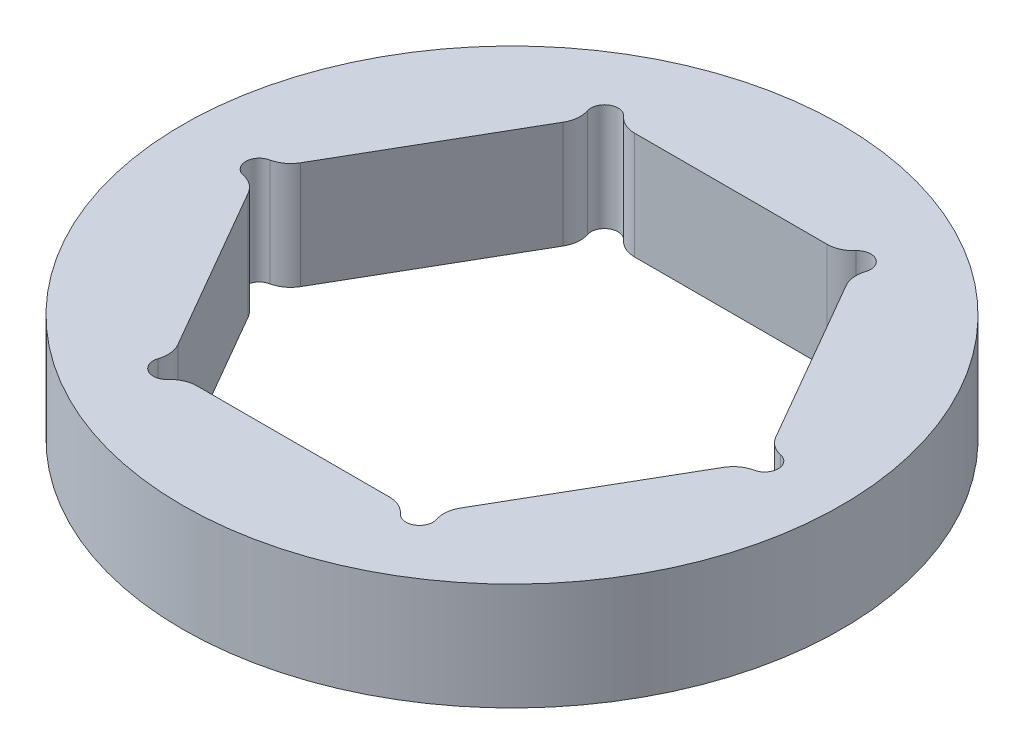
ISO-10303-21;
HEADER;
FILE_DESCRIPTION(('STEP AP214'),'2;1');
FILE_NAME('part.step','',(''),(''),'','','');
FILE_SCHEMA(('AUTOMOTIVE_DESIGN { 1 0 10303 214 1 1 1 1 }'));
ENDSEC;
DATA;
#1=APPLICATION_CONTEXT('core data for automotive mechanical design processes');
#2=APPLICATION_PROTOCOL_DEFINITION('international standard','automotive_design',2000,#1);
#3=PRODUCT_CONTEXT('',#1,'mechanical');
#4=PRODUCT('Part','Part','',(#3));
#5=PRODUCT_RELATED_PRODUCT_CATEGORY('part','',(#4));
#6=PRODUCT_DEFINITION_FORMATION('','',#4);
#7=PRODUCT_DEFINITION_CONTEXT('part definition',#1,'design');
#8=PRODUCT_DEFINITION('design','',#6,#7);
#9=PRODUCT_DEFINITION_SHAPE('','',#8);
#10=(LENGTH_UNIT() NAMED_UNIT(*) SI_UNIT(.MILLI.,.METRE.));
#11=(NAMED_UNIT(*) PLANE_ANGLE_UNIT() SI_UNIT($,.RADIAN.));
#12=(NAMED_UNIT(*) SI_UNIT($,.STERADIAN.) SOLID_ANGLE_UNIT());
#13=UNCERTAINTY_MEASURE_WITH_UNIT(LENGTH_MEASURE(1.E-05),#10,'distance_accuracy_value','');
#14=(GEOMETRIC_REPRESENTATION_CONTEXT(3) GLOBAL_UNCERTAINTY_ASSIGNED_CONTEXT((#13)) GLOBAL_UNIT_ASSIGNED_CONTEXT((#10,
#11,#12)) REPRESENTATION_CONTEXT('',''));
#15=CARTESIAN_POINT('',(0.,0.,0.));
#16=DIRECTION('',(0.,0.,1.));
#17=DIRECTION('',(1.,0.,0.));
#18=AXIS2_PLACEMENT_3D('',#15,#16,#17);
#19=CARTESIAN_POINT('',(0.,1.5875,0.));
#20=DIRECTION('',(0.,1.,0.));
#21=DIRECTION('',(0.,0.,1.));
#22=AXIS2_PLACEMENT_3D('',#19,#20,#21);
#23=PLANE('',#22);
#24=CARTESIAN_POINT('',(0.,1.5875,0.));
#25=DIRECTION('',(0.,1.,0.));
#26=DIRECTION('',(0.,0.,1.));
#27=AXIS2_PLACEMENT_3D('',#24,#25,#26);
#28=CIRCLE('',#27,9.7536);
#29=CARTESIAN_POINT('',(0.,1.5875,9.7536));
#30=VERTEX_POINT('',#29);
#31=EDGE_CURVE('E11',#30,#30,#28,.T.);
#32=ORIENTED_EDGE('',*,*,#31,.T.);
#33=EDGE_LOOP('',(#32));
#34=FACE_BOUND('',#33,.T.);
#35=CARTESIAN_POINT('',(-3.7394976935412,1.5875,-6.477));
#36=DIRECTION('',(0.,1.,0.));
#37=DIRECTION('',(0.,0.,1.));
#38=AXIS2_PLACEMENT_3D('',#35,#36,#37);
#39=CIRCLE('',#38,0.4);
#40=CARTESIAN_POINT('',(-3.44135529654123,1.5875,-6.74366666666667));
#41=VERTEX_POINT('',#40);
#42=CARTESIAN_POINT('',(-4.11950899971704,1.5875,-6.35213444358617));
#43=VERTEX_POINT('',#42);
#44=EDGE_CURVE('E210',#41,#43,#39,.T.);
#45=ORIENTED_EDGE('',*,*,#44,.F.);
#46=CARTESIAN_POINT('',(-2.84507050254129,1.5875,-7.277));
#47=DIRECTION('',(0.,-1.,0.));
#48=DIRECTION('',(0.,0.,1.));
#49=AXIS2_PLACEMENT_3D('',#46,#47,#48);
#50=CIRCLE('',#49,0.8);
#51=CARTESIAN_POINT('',(-2.84507050254129,1.5875,-6.477));
#52=VERTEX_POINT('',#51);
#53=EDGE_CURVE('E202',#52,#41,#50,.T.);
#54=ORIENTED_EDGE('',*,*,#53,.F.);
#55=DIRECTION('',(-1.,0.,0.));
#56=VECTOR('',#55,1.);
#57=CARTESIAN_POINT('',(2.84507050254129,1.5875,-6.477));
#58=LINE('',#57,#56);
#59=CARTESIAN_POINT('',(2.84507050254129,1.5875,-6.477));
#60=VERTEX_POINT('',#59);
#61=EDGE_CURVE('E266',#60,#52,#58,.T.);
#62=ORIENTED_EDGE('',*,*,#61,.F.);
#63=CARTESIAN_POINT('',(2.84507050254129,1.5875,-7.277));
#64=DIRECTION('',(0.,-1.,0.));
#65=DIRECTION('',(0.,0.,1.));
#66=AXIS2_PLACEMENT_3D('',#63,#64,#65);
#67=CIRCLE('',#66,0.800000000000002);
#68=CARTESIAN_POINT('',(3.44135529654124,1.5875,-6.74366666666666));
#69=VERTEX_POINT('',#68);
#70=EDGE_CURVE('E264',#69,#60,#67,.T.);
#71=ORIENTED_EDGE('',*,*,#70,.F.);
#72=CARTESIAN_POINT('',(3.73949769354121,1.5875,-6.477));
#73=DIRECTION('',(0.,1.,0.));
#74=DIRECTION('',(0.,0.,1.));
#75=AXIS2_PLACEMENT_3D('',#72,#73,#74);
#76=CIRCLE('',#75,0.4);
#77=CARTESIAN_POINT('',(4.11950899971704,1.5875,-6.35213444358617));
#78=VERTEX_POINT('',#77);
#79=EDGE_CURVE('E262',#78,#69,#76,.T.);
#80=ORIENTED_EDGE('',*,*,#79,.F.);
#81=CARTESIAN_POINT('',(4.87953161206872,1.5875,-6.10240333075852));
#82=DIRECTION('',(0.,-1.,0.));
#83=DIRECTION('',(0.,0.,1.));
#84=AXIS2_PLACEMENT_3D('',#81,#82,#83);
#85=CIRCLE('',#84,0.799999999999999);
#86=CARTESIAN_POINT('',(4.18671128904117,1.5875,-5.70240333075852));
#87=VERTEX_POINT('',#86);
#88=EDGE_CURVE('E260',#87,#78,#85,.T.);
#89=ORIENTED_EDGE('',*,*,#88,.F.);
#90=DIRECTION('',(-0.5,0.,-0.866025403784439));
#91=VECTOR('',#90,1.);
#92=CARTESIAN_POINT('',(7.03178179158246,1.5875,-0.77459666924148));
#93=LINE('',#92,#91);
#94=CARTESIAN_POINT('',(7.03178179158246,1.5875,-0.77459666924148));
#95=VERTEX_POINT('',#94);
#96=EDGE_CURVE('E258',#95,#87,#93,.T.);
#97=ORIENTED_EDGE('',*,*,#96,.F.);
#98=CARTESIAN_POINT('',(7.72460211461001,1.5875,-1.17459666924148));
#99=DIRECTION('',(0.,-1.,0.));
#100=DIRECTION('',(0.,0.,1.));
#101=AXIS2_PLACEMENT_3D('',#98,#99,#100);
#102=CIRCLE('',#101,0.800000000000001);
#103=CARTESIAN_POINT('',(7.56086429625828,1.5875,-0.391532223080492));
#104=VERTEX_POINT('',#103);
#105=EDGE_CURVE('E256',#104,#95,#102,.T.);
#106=ORIENTED_EDGE('',*,*,#105,.F.);
#107=CARTESIAN_POINT('',(7.47899538708241,1.5875,0.));
#108=DIRECTION('',(0.,1.,0.));
#109=DIRECTION('',(0.,0.,1.));
#110=AXIS2_PLACEMENT_3D('',#107,#108,#109);
#111=CIRCLE('',#110,0.4);
#112=CARTESIAN_POINT('',(7.56086429625828,1.5875,0.391532223080496));
#113=VERTEX_POINT('',#112);
#114=EDGE_CURVE('E254',#113,#104,#111,.T.);
#115=ORIENTED_EDGE('',*,*,#114,.F.);
#116=CARTESIAN_POINT('',(7.72460211461001,1.5875,1.17459666924148));
#117=DIRECTION('',(0.,-1.,0.));
#118=DIRECTION('',(0.,0.,1.));
#119=AXIS2_PLACEMENT_3D('',#116,#117,#118);
#120=CIRCLE('',#119,0.8);
#121=CARTESIAN_POINT('',(7.03178179158246,1.5875,0.774596669241483));
#122=VERTEX_POINT('',#121);
#123=EDGE_CURVE('E252',#122,#113,#120,.T.);
#124=ORIENTED_EDGE('',*,*,#123,.F.);
#125=DIRECTION('',(0.5,0.,-0.866025403784438));
#126=VECTOR('',#125,1.);
#127=CARTESIAN_POINT('',(4.18671128904117,1.5875,5.70240333075852));
#128=LINE('',#127,#126);
#129=CARTESIAN_POINT('',(4.18671128904117,1.5875,5.70240333075852));
#130=VERTEX_POINT('',#129);
#131=EDGE_CURVE('E250',#130,#122,#128,.T.);
#132=ORIENTED_EDGE('',*,*,#131,.F.);
#133=CARTESIAN_POINT('',(4.87953161206872,1.5875,6.10240333075852));
#134=DIRECTION('',(0.,-1.,0.));
#135=DIRECTION('',(0.,0.,1.));
#136=AXIS2_PLACEMENT_3D('',#133,#134,#135);
#137=CIRCLE('',#136,0.800000000000001);
#138=CARTESIAN_POINT('',(4.11950899971704,1.5875,6.35213444358617));
#139=VERTEX_POINT('',#138);
#140=EDGE_CURVE('E248',#139,#130,#137,.T.);
#141=ORIENTED_EDGE('',*,*,#140,.F.);
#142=CARTESIAN_POINT('',(3.73949769354121,1.5875,6.477));
#143=DIRECTION('',(0.,1.,0.));
#144=DIRECTION('',(0.,0.,1.));
#145=AXIS2_PLACEMENT_3D('',#142,#143,#144);
#146=CIRCLE('',#145,0.4);
#147=CARTESIAN_POINT('',(3.44135529654124,1.5875,6.74366666666667));
#148=VERTEX_POINT('',#147);
#149=EDGE_CURVE('E246',#148,#139,#146,.T.);
#150=ORIENTED_EDGE('',*,*,#149,.F.);
#151=CARTESIAN_POINT('',(2.8450705025413,1.5875,7.277));
#152=DIRECTION('',(0.,-1.,0.));
#153=DIRECTION('',(0.,0.,1.));
#154=AXIS2_PLACEMENT_3D('',#151,#152,#153);
#155=CIRCLE('',#154,0.799999999999996);
#156=CARTESIAN_POINT('',(2.8450705025413,1.5875,6.477));
#157=VERTEX_POINT('',#156);
#158=EDGE_CURVE('E244',#157,#148,#155,.T.);
#159=ORIENTED_EDGE('',*,*,#158,.F.);
#160=DIRECTION('',(1.,0.,0.));
#161=VECTOR('',#160,1.);
#162=CARTESIAN_POINT('',(-2.84507050254129,1.5875,6.477));
#163=LINE('',#162,#161);
#164=CARTESIAN_POINT('',(-2.84507050254129,1.5875,6.477));
#165=VERTEX_POINT('',#164);
#166=EDGE_CURVE('E242',#165,#157,#163,.T.);
#167=ORIENTED_EDGE('',*,*,#166,.F.);
#168=CARTESIAN_POINT('',(-2.84507050254129,1.5875,7.277));
#169=DIRECTION('',(0.,-1.,0.));
#170=DIRECTION('',(0.,0.,1.));
#171=AXIS2_PLACEMENT_3D('',#168,#169,#170);
#172=CIRCLE('',#171,0.799999999999998);
#173=CARTESIAN_POINT('',(-3.44135529654123,1.5875,6.74366666666667));
#174=VERTEX_POINT('',#173);
#175=EDGE_CURVE('E240',#174,#165,#172,.T.);
#176=ORIENTED_EDGE('',*,*,#175,.F.);
#177=CARTESIAN_POINT('',(-3.7394976935412,1.5875,6.477));
#178=DIRECTION('',(0.,1.,0.));
#179=DIRECTION('',(0.,0.,1.));
#180=AXIS2_PLACEMENT_3D('',#177,#178,#179);
#181=CIRCLE('',#180,0.4);
#182=CARTESIAN_POINT('',(-4.11950899971704,1.5875,6.35213444358618));
#183=VERTEX_POINT('',#182);
#184=EDGE_CURVE('E238',#183,#174,#181,.T.);
#185=ORIENTED_EDGE('',*,*,#184,.F.);
#186=CARTESIAN_POINT('',(-4.87953161206871,1.5875,6.10240333075852));
#187=DIRECTION('',(0.,-1.,0.));
#188=DIRECTION('',(0.,0.,1.));
#189=AXIS2_PLACEMENT_3D('',#186,#187,#188);
#190=CIRCLE('',#189,0.8);
#191=CARTESIAN_POINT('',(-4.18671128904116,1.5875,5.70240333075852));
#192=VERTEX_POINT('',#191);
#193=EDGE_CURVE('E236',#192,#183,#190,.T.);
#194=ORIENTED_EDGE('',*,*,#193,.F.);
#195=DIRECTION('',(0.5,0.,0.866025403784438));
#196=VECTOR('',#195,1.);
#197=CARTESIAN_POINT('',(-7.03178179158245,1.5875,0.774596669241489));
#198=LINE('',#197,#196);
#199=CARTESIAN_POINT('',(-7.03178179158245,1.5875,0.774596669241489));
#200=VERTEX_POINT('',#199);
#201=EDGE_CURVE('E234',#200,#192,#198,.T.);
#202=ORIENTED_EDGE('',*,*,#201,.F.);
#203=CARTESIAN_POINT('',(-7.72460211461,1.5875,1.17459666924149));
#204=DIRECTION('',(0.,-1.,0.));
#205=DIRECTION('',(0.,0.,1.));
#206=AXIS2_PLACEMENT_3D('',#203,#204,#205);
#207=CIRCLE('',#206,0.8);
#208=CARTESIAN_POINT('',(-7.56086429625827,1.5875,0.3915322230805));
#209=VERTEX_POINT('',#208);
#210=EDGE_CURVE('E232',#209,#200,#207,.T.);
#211=ORIENTED_EDGE('',*,*,#210,.F.);
#212=CARTESIAN_POINT('',(-7.47899538708241,1.5875,0.));
#213=DIRECTION('',(0.,1.,0.));
#214=DIRECTION('',(0.,0.,1.));
#215=AXIS2_PLACEMENT_3D('',#212,#213,#214);
#216=CIRCLE('',#215,0.4);
#217=CARTESIAN_POINT('',(-7.56086429625827,1.5875,-0.391532223080488));
#218=VERTEX_POINT('',#217);
#219=EDGE_CURVE('E230',#218,#209,#216,.T.);
#220=ORIENTED_EDGE('',*,*,#219,.F.);
#221=CARTESIAN_POINT('',(-7.72460211461001,1.5875,-1.17459666924148));
#222=DIRECTION('',(0.,-1.,0.));
#223=DIRECTION('',(0.,0.,1.));
#224=AXIS2_PLACEMENT_3D('',#221,#222,#223);
#225=CIRCLE('',#224,0.8);
#226=CARTESIAN_POINT('',(-7.03178179158246,1.5875,-0.774596669241475));
#227=VERTEX_POINT('',#226);
#228=EDGE_CURVE('E228',#227,#218,#225,.T.);
#229=ORIENTED_EDGE('',*,*,#228,.F.);
#230=DIRECTION('',(-0.5,0.,0.866025403784438));
#231=VECTOR('',#230,1.);
#232=CARTESIAN_POINT('',(-4.18671128904116,1.5875,-5.70240333075852));
#233=LINE('',#232,#231);
#234=CARTESIAN_POINT('',(-4.18671128904116,1.5875,-5.70240333075852));
#235=VERTEX_POINT('',#234);
#236=EDGE_CURVE('E224',#235,#227,#233,.T.);
#237=ORIENTED_EDGE('',*,*,#236,.F.);
#238=CARTESIAN_POINT('',(-4.87953161206871,1.5875,-6.10240333075852));
#239=DIRECTION('',(0.,-1.,0.));
#240=DIRECTION('',(0.,0.,1.));
#241=AXIS2_PLACEMENT_3D('',#238,#239,#240);
#242=CIRCLE('',#241,0.8);
#243=EDGE_CURVE('E222',#43,#235,#242,.T.);
#244=ORIENTED_EDGE('',*,*,#243,.F.);
#245=EDGE_LOOP('',(#45,#54,#62,#71,#80,#89,#97,#106,#115,#124,#132,#141,#150,#159,#167,#176,
#185,#194,#202,#211,#220,#229,#237,#244));
#246=FACE_BOUND('',#245,.T.);
#247=ADVANCED_FACE('F41',(#34,#246),#23,.T.);
#248=CARTESIAN_POINT('',(0.,-1.5875,0.));
#249=DIRECTION('',(0.,1.,0.));
#250=DIRECTION('',(0.,0.,1.));
#251=AXIS2_PLACEMENT_3D('',#248,#249,#250);
#252=PLANE('',#251);
#253=CARTESIAN_POINT('',(0.,-1.5875,0.));
#254=DIRECTION('',(0.,1.,0.));
#255=DIRECTION('',(0.,0.,1.));
#256=AXIS2_PLACEMENT_3D('',#253,#254,#255);
#257=CIRCLE('',#256,9.7536);
#258=CARTESIAN_POINT('',(0.,-1.5875,9.7536));
#259=VERTEX_POINT('',#258);
#260=EDGE_CURVE('E45',#259,#259,#257,.T.);
#261=ORIENTED_EDGE('',*,*,#260,.F.);
#262=EDGE_LOOP('',(#261));
#263=FACE_BOUND('',#262,.T.);
#264=CARTESIAN_POINT('',(-2.84507050254129,-1.5875,-7.277));
#265=DIRECTION('',(0.,-1.,0.));
#266=DIRECTION('',(0.,0.,1.));
#267=AXIS2_PLACEMENT_3D('',#264,#265,#266);
#268=CIRCLE('',#267,0.8);
#269=CARTESIAN_POINT('',(-2.84507050254129,-1.5875,-6.477));
#270=VERTEX_POINT('',#269);
#271=CARTESIAN_POINT('',(-3.44135529654123,-1.5875,-6.74366666666667));
#272=VERTEX_POINT('',#271);
#273=EDGE_CURVE('E64',#270,#272,#268,.T.);
#274=ORIENTED_EDGE('',*,*,#273,.T.);
#275=CARTESIAN_POINT('',(-3.7394976935412,-1.5875,-6.477));
#276=DIRECTION('',(0.,1.,0.));
#277=DIRECTION('',(0.,0.,1.));
#278=AXIS2_PLACEMENT_3D('',#275,#276,#277);
#279=CIRCLE('',#278,0.4);
#280=CARTESIAN_POINT('',(-4.11950899971704,-1.5875,-6.35213444358617));
#281=VERTEX_POINT('',#280);
#282=EDGE_CURVE('E217',#272,#281,#279,.T.);
#283=ORIENTED_EDGE('',*,*,#282,.T.);
#284=CARTESIAN_POINT('',(-4.87953161206871,-1.5875,-6.10240333075852));
#285=DIRECTION('',(0.,-1.,0.));
#286=DIRECTION('',(0.,0.,1.));
#287=AXIS2_PLACEMENT_3D('',#284,#285,#286);
#288=CIRCLE('',#287,0.8);
#289=CARTESIAN_POINT('',(-4.18671128904116,-1.5875,-5.70240333075852));
#290=VERTEX_POINT('',#289);
#291=EDGE_CURVE('E270',#281,#290,#288,.T.);
#292=ORIENTED_EDGE('',*,*,#291,.T.);
#293=DIRECTION('',(-0.5,0.,0.866025403784438));
#294=VECTOR('',#293,1.);
#295=CARTESIAN_POINT('',(-4.18671128904116,-1.5875,-5.70240333075852));
#296=LINE('',#295,#294);
#297=CARTESIAN_POINT('',(-7.03178179158246,-1.5875,-0.774596669241475));
#298=VERTEX_POINT('',#297);
#299=EDGE_CURVE('E273',#290,#298,#296,.T.);
#300=ORIENTED_EDGE('',*,*,#299,.T.);
#301=CARTESIAN_POINT('',(-7.72460211461001,-1.5875,-1.17459666924148));
#302=DIRECTION('',(0.,-1.,0.));
#303=DIRECTION('',(0.,0.,1.));
#304=AXIS2_PLACEMENT_3D('',#301,#302,#303);
#305=CIRCLE('',#304,0.8);
#306=CARTESIAN_POINT('',(-7.56086429625827,-1.5875,-0.391532223080488));
#307=VERTEX_POINT('',#306);
#308=EDGE_CURVE('E276',#298,#307,#305,.T.);
#309=ORIENTED_EDGE('',*,*,#308,.T.);
#310=CARTESIAN_POINT('',(-7.47899538708241,-1.5875,0.));
#311=DIRECTION('',(0.,1.,0.));
#312=DIRECTION('',(0.,0.,1.));
#313=AXIS2_PLACEMENT_3D('',#310,#311,#312);
#314=CIRCLE('',#313,0.4);
#315=CARTESIAN_POINT('',(-7.56086429625827,-1.5875,0.3915322230805));
#316=VERTEX_POINT('',#315);
#317=EDGE_CURVE('E279',#307,#316,#314,.T.);
#318=ORIENTED_EDGE('',*,*,#317,.T.);
#319=CARTESIAN_POINT('',(-7.72460211461,-1.5875,1.17459666924149));
#320=DIRECTION('',(0.,-1.,0.));
#321=DIRECTION('',(0.,0.,1.));
#322=AXIS2_PLACEMENT_3D('',#319,#320,#321);
#323=CIRCLE('',#322,0.8);
#324=CARTESIAN_POINT('',(-7.03178179158245,-1.5875,0.774596669241489));
#325=VERTEX_POINT('',#324);
#326=EDGE_CURVE('E282',#316,#325,#323,.T.);
#327=ORIENTED_EDGE('',*,*,#326,.T.);
#328=DIRECTION('',(0.5,0.,0.866025403784438));
#329=VECTOR('',#328,1.);
#330=CARTESIAN_POINT('',(-7.03178179158245,-1.5875,0.774596669241489));
#331=LINE('',#330,#329);
#332=CARTESIAN_POINT('',(-4.18671128904116,-1.5875,5.70240333075852));
#333=VERTEX_POINT('',#332);
#334=EDGE_CURVE('E285',#325,#333,#331,.T.);
#335=ORIENTED_EDGE('',*,*,#334,.T.);
#336=CARTESIAN_POINT('',(-4.87953161206871,-1.5875,6.10240333075852));
#337=DIRECTION('',(0.,-1.,0.));
#338=DIRECTION('',(0.,0.,1.));
#339=AXIS2_PLACEMENT_3D('',#336,#337,#338);
#340=CIRCLE('',#339,0.8);
#341=CARTESIAN_POINT('',(-4.11950899971704,-1.5875,6.35213444358618));
#342=VERTEX_POINT('',#341);
#343=EDGE_CURVE('E288',#333,#342,#340,.T.);
#344=ORIENTED_EDGE('',*,*,#343,.T.);
#345=CARTESIAN_POINT('',(-3.7394976935412,-1.5875,6.477));
#346=DIRECTION('',(0.,1.,0.));
#347=DIRECTION('',(0.,0.,1.));
#348=AXIS2_PLACEMENT_3D('',#345,#346,#347);
#349=CIRCLE('',#348,0.4);
#350=CARTESIAN_POINT('',(-3.44135529654123,-1.5875,6.74366666666667));
#351=VERTEX_POINT('',#350);
#352=EDGE_CURVE('E291',#342,#351,#349,.T.);
#353=ORIENTED_EDGE('',*,*,#352,.T.);
#354=CARTESIAN_POINT('',(-2.84507050254129,-1.5875,7.277));
#355=DIRECTION('',(0.,-1.,0.));
#356=DIRECTION('',(0.,0.,1.));
#357=AXIS2_PLACEMENT_3D('',#354,#355,#356);
#358=CIRCLE('',#357,0.799999999999998);
#359=CARTESIAN_POINT('',(-2.84507050254129,-1.5875,6.477));
#360=VERTEX_POINT('',#359);
#361=EDGE_CURVE('E294',#351,#360,#358,.T.);
#362=ORIENTED_EDGE('',*,*,#361,.T.);
#363=DIRECTION('',(1.,0.,0.));
#364=VECTOR('',#363,1.);
#365=CARTESIAN_POINT('',(-2.84507050254129,-1.5875,6.477));
#366=LINE('',#365,#364);
#367=CARTESIAN_POINT('',(2.8450705025413,-1.5875,6.477));
#368=VERTEX_POINT('',#367);
#369=EDGE_CURVE('E297',#360,#368,#366,.T.);
#370=ORIENTED_EDGE('',*,*,#369,.T.);
#371=CARTESIAN_POINT('',(2.8450705025413,-1.5875,7.277));
#372=DIRECTION('',(0.,-1.,0.));
#373=DIRECTION('',(0.,0.,1.));
#374=AXIS2_PLACEMENT_3D('',#371,#372,#373);
#375=CIRCLE('',#374,0.799999999999996);
#376=CARTESIAN_POINT('',(3.44135529654124,-1.5875,6.74366666666667));
#377=VERTEX_POINT('',#376);
#378=EDGE_CURVE('E300',#368,#377,#375,.T.);
#379=ORIENTED_EDGE('',*,*,#378,.T.);
#380=CARTESIAN_POINT('',(3.73949769354121,-1.5875,6.477));
#381=DIRECTION('',(0.,1.,0.));
#382=DIRECTION('',(0.,0.,1.));
#383=AXIS2_PLACEMENT_3D('',#380,#381,#382);
#384=CIRCLE('',#383,0.4);
#385=CARTESIAN_POINT('',(4.11950899971704,-1.5875,6.35213444358617));
#386=VERTEX_POINT('',#385);
#387=EDGE_CURVE('E303',#377,#386,#384,.T.);
#388=ORIENTED_EDGE('',*,*,#387,.T.);
#389=CARTESIAN_POINT('',(4.87953161206872,-1.5875,6.10240333075852));
#390=DIRECTION('',(0.,-1.,0.));
#391=DIRECTION('',(0.,0.,1.));
#392=AXIS2_PLACEMENT_3D('',#389,#390,#391);
#393=CIRCLE('',#392,0.800000000000001);
#394=CARTESIAN_POINT('',(4.18671128904117,-1.5875,5.70240333075852));
#395=VERTEX_POINT('',#394);
#396=EDGE_CURVE('E306',#386,#395,#393,.T.);
#397=ORIENTED_EDGE('',*,*,#396,.T.);
#398=DIRECTION('',(0.5,0.,-0.866025403784438));
#399=VECTOR('',#398,1.);
#400=CARTESIAN_POINT('',(4.18671128904117,-1.5875,5.70240333075852));
#401=LINE('',#400,#399);
#402=CARTESIAN_POINT('',(7.03178179158246,-1.5875,0.774596669241483));
#403=VERTEX_POINT('',#402);
#404=EDGE_CURVE('E309',#395,#403,#401,.T.);
#405=ORIENTED_EDGE('',*,*,#404,.T.);
#406=CARTESIAN_POINT('',(7.72460211461001,-1.5875,1.17459666924148));
#407=DIRECTION('',(0.,-1.,0.));
#408=DIRECTION('',(0.,0.,1.));
#409=AXIS2_PLACEMENT_3D('',#406,#407,#408);
#410=CIRCLE('',#409,0.8);
#411=CARTESIAN_POINT('',(7.56086429625828,-1.5875,0.391532223080496));
#412=VERTEX_POINT('',#411);
#413=EDGE_CURVE('E312',#403,#412,#410,.T.);
#414=ORIENTED_EDGE('',*,*,#413,.T.);
#415=CARTESIAN_POINT('',(7.47899538708241,-1.5875,0.));
#416=DIRECTION('',(0.,1.,0.));
#417=DIRECTION('',(0.,0.,1.));
#418=AXIS2_PLACEMENT_3D('',#415,#416,#417);
#419=CIRCLE('',#418,0.4);
#420=CARTESIAN_POINT('',(7.56086429625828,-1.5875,-0.391532223080492));
#421=VERTEX_POINT('',#420);
#422=EDGE_CURVE('E315',#412,#421,#419,.T.);
#423=ORIENTED_EDGE('',*,*,#422,.T.);
#424=CARTESIAN_POINT('',(7.72460211461001,-1.5875,-1.17459666924148));
#425=DIRECTION('',(0.,-1.,0.));
#426=DIRECTION('',(0.,0.,1.));
#427=AXIS2_PLACEMENT_3D('',#424,#425,#426);
#428=CIRCLE('',#427,0.800000000000001);
#429=CARTESIAN_POINT('',(7.03178179158246,-1.5875,-0.77459666924148));
#430=VERTEX_POINT('',#429);
#431=EDGE_CURVE('E318',#421,#430,#428,.T.);
#432=ORIENTED_EDGE('',*,*,#431,.T.);
#433=DIRECTION('',(-0.5,0.,-0.866025403784439));
#434=VECTOR('',#433,1.);
#435=CARTESIAN_POINT('',(7.03178179158246,-1.5875,-0.77459666924148));
#436=LINE('',#435,#434);
#437=CARTESIAN_POINT('',(4.18671128904117,-1.5875,-5.70240333075852));
#438=VERTEX_POINT('',#437);
#439=EDGE_CURVE('E321',#430,#438,#436,.T.);
#440=ORIENTED_EDGE('',*,*,#439,.T.);
#441=CARTESIAN_POINT('',(4.87953161206872,-1.5875,-6.10240333075852));
#442=DIRECTION('',(0.,-1.,0.));
#443=DIRECTION('',(0.,0.,1.));
#444=AXIS2_PLACEMENT_3D('',#441,#442,#443);
#445=CIRCLE('',#444,0.799999999999999);
#446=CARTESIAN_POINT('',(4.11950899971704,-1.5875,-6.35213444358617));
#447=VERTEX_POINT('',#446);
#448=EDGE_CURVE('E324',#438,#447,#445,.T.);
#449=ORIENTED_EDGE('',*,*,#448,.T.);
#450=CARTESIAN_POINT('',(3.73949769354121,-1.5875,-6.477));
#451=DIRECTION('',(0.,1.,0.));
#452=DIRECTION('',(0.,0.,1.));
#453=AXIS2_PLACEMENT_3D('',#450,#451,#452);
#454=CIRCLE('',#453,0.4);
#455=CARTESIAN_POINT('',(3.44135529654124,-1.5875,-6.74366666666666));
#456=VERTEX_POINT('',#455);
#457=EDGE_CURVE('E327',#447,#456,#454,.T.);
#458=ORIENTED_EDGE('',*,*,#457,.T.);
#459=CARTESIAN_POINT('',(2.84507050254129,-1.5875,-7.277));
#460=DIRECTION('',(0.,-1.,0.));
#461=DIRECTION('',(0.,0.,1.));
#462=AXIS2_PLACEMENT_3D('',#459,#460,#461);
#463=CIRCLE('',#462,0.800000000000002);
#464=CARTESIAN_POINT('',(2.84507050254129,-1.5875,-6.477));
#465=VERTEX_POINT('',#464);
#466=EDGE_CURVE('E330',#456,#465,#463,.T.);
#467=ORIENTED_EDGE('',*,*,#466,.T.);
#468=DIRECTION('',(-1.,0.,0.));
#469=VECTOR('',#468,1.);
#470=CARTESIAN_POINT('',(2.84507050254129,-1.5875,-6.477));
#471=LINE('',#470,#469);
#472=EDGE_CURVE('E211',#465,#270,#471,.T.);
#473=ORIENTED_EDGE('',*,*,#472,.T.);
#474=EDGE_LOOP('',(#274,#283,#292,#300,#309,#318,#327,#335,#344,#353,#362,#370,#379,#388,#397,
#405,#414,#423,#432,#440,#449,#458,#467,#473));
#475=FACE_BOUND('',#474,.T.);
#476=ADVANCED_FACE('F383',(#263,#475),#252,.F.);
#477=CARTESIAN_POINT('',(0.,1.5875,0.));
#478=DIRECTION('',(0.,-1.,0.));
#479=DIRECTION('',(0.,0.,-1.));
#480=AXIS2_PLACEMENT_3D('',#477,#478,#479);
#481=CYLINDRICAL_SURFACE('',#480,9.7536);
#482=ORIENTED_EDGE('',*,*,#31,.F.);
#483=EDGE_LOOP('',(#482));
#484=FACE_BOUND('',#483,.T.);
#485=ORIENTED_EDGE('',*,*,#260,.T.);
#486=EDGE_LOOP('',(#485));
#487=FACE_BOUND('',#486,.T.);
#488=ADVANCED_FACE('F43',(#484,#487),#481,.T.);
#489=CARTESIAN_POINT('',(-2.84507050254129,1.5875,-7.277));
#490=DIRECTION('',(0.,-1.,0.));
#491=DIRECTION('',(0.,0.,-1.));
#492=AXIS2_PLACEMENT_3D('',#489,#490,#491);
#493=CYLINDRICAL_SURFACE('',#492,0.8);
#494=ORIENTED_EDGE('',*,*,#273,.F.);
#495=DIRECTION('',(0.,-1.,0.));
#496=VECTOR('',#495,1.);
#497=CARTESIAN_POINT('',(-2.84507050254129,1.5875,-6.477));
#498=LINE('',#497,#496);
#499=EDGE_CURVE('E206',#52,#270,#498,.T.);
#500=ORIENTED_EDGE('',*,*,#499,.F.);
#501=ORIENTED_EDGE('',*,*,#53,.T.);
#502=DIRECTION('',(0.,-1.,0.));
#503=VECTOR('',#502,1.);
#504=CARTESIAN_POINT('',(-3.44135529654123,1.5875,-6.74366666666667));
#505=LINE('',#504,#503);
#506=EDGE_CURVE('E205',#41,#272,#505,.T.);
#507=ORIENTED_EDGE('',*,*,#506,.T.);
#508=EDGE_LOOP('',(#494,#500,#501,#507));
#509=FACE_BOUND('',#508,.T.);
#510=ADVANCED_FACE('F204',(#509),#493,.T.);
#511=CARTESIAN_POINT('',(-3.7394976935412,1.5875,-6.477));
#512=DIRECTION('',(0.,-1.,0.));
#513=DIRECTION('',(0.,0.,-1.));
#514=AXIS2_PLACEMENT_3D('',#511,#512,#513);
#515=CYLINDRICAL_SURFACE('',#514,0.4);
#516=ORIENTED_EDGE('',*,*,#282,.F.);
#517=ORIENTED_EDGE('',*,*,#506,.F.);
#518=ORIENTED_EDGE('',*,*,#44,.T.);
#519=DIRECTION('',(0.,-1.,0.));
#520=VECTOR('',#519,1.);
#521=CARTESIAN_POINT('',(-4.11950899971704,1.5875,-6.35213444358617));
#522=LINE('',#521,#520);
#523=EDGE_CURVE('E218',#43,#281,#522,.T.);
#524=ORIENTED_EDGE('',*,*,#523,.T.);
#525=EDGE_LOOP('',(#516,#517,#518,#524));
#526=FACE_BOUND('',#525,.T.);
#527=ADVANCED_FACE('F214',(#526),#515,.F.);
#528=CARTESIAN_POINT('',(-4.87953161206871,1.5875,-6.10240333075852));
#529=DIRECTION('',(0.,-1.,0.));
#530=DIRECTION('',(0.,0.,-1.));
#531=AXIS2_PLACEMENT_3D('',#528,#529,#530);
#532=CYLINDRICAL_SURFACE('',#531,0.8);
#533=ORIENTED_EDGE('',*,*,#291,.F.);
#534=ORIENTED_EDGE('',*,*,#523,.F.);
#535=ORIENTED_EDGE('',*,*,#243,.T.);
#536=DIRECTION('',(0.,-1.,0.));
#537=VECTOR('',#536,1.);
#538=CARTESIAN_POINT('',(-4.18671128904116,1.5875,-5.70240333075852));
#539=LINE('',#538,#537);
#540=EDGE_CURVE('E375',#235,#290,#539,.T.);
#541=ORIENTED_EDGE('',*,*,#540,.T.);
#542=EDGE_LOOP('',(#533,#534,#535,#541));
#543=FACE_BOUND('',#542,.T.);
#544=ADVANCED_FACE('F379',(#543),#532,.T.);
#545=CARTESIAN_POINT('',(-4.18671128904116,1.5875,-5.70240333075852));
#546=DIRECTION('',(0.866025403784439,0.,0.5));
#547=DIRECTION('',(0.5,0.,-0.866025403784439));
#548=AXIS2_PLACEMENT_3D('',#545,#546,#547);
#549=PLANE('',#548);
#550=ORIENTED_EDGE('',*,*,#299,.F.);
#551=ORIENTED_EDGE('',*,*,#540,.F.);
#552=ORIENTED_EDGE('',*,*,#236,.T.);
#553=DIRECTION('',(0.,-1.,0.));
#554=VECTOR('',#553,1.);
#555=CARTESIAN_POINT('',(-7.03178179158246,1.5875,-0.774596669241475));
#556=LINE('',#555,#554);
#557=EDGE_CURVE('E373',#227,#298,#556,.T.);
#558=ORIENTED_EDGE('',*,*,#557,.T.);
#559=EDGE_LOOP('',(#550,#551,#552,#558));
#560=FACE_BOUND('',#559,.T.);
#561=ADVANCED_FACE('F481',(#560),#549,.T.);
#562=CARTESIAN_POINT('',(-7.72460211461001,1.5875,-1.17459666924148));
#563=DIRECTION('',(0.,-1.,0.));
#564=DIRECTION('',(0.,0.,-1.));
#565=AXIS2_PLACEMENT_3D('',#562,#563,#564);
#566=CYLINDRICAL_SURFACE('',#565,0.8);
#567=ORIENTED_EDGE('',*,*,#308,.F.);
#568=ORIENTED_EDGE('',*,*,#557,.F.);
#569=ORIENTED_EDGE('',*,*,#228,.T.);
#570=DIRECTION('',(0.,-1.,0.));
#571=VECTOR('',#570,1.);
#572=CARTESIAN_POINT('',(-7.56086429625827,1.5875,-0.391532223080488));
#573=LINE('',#572,#571);
#574=EDGE_CURVE('E371',#218,#307,#573,.T.);
#575=ORIENTED_EDGE('',*,*,#574,.T.);
#576=EDGE_LOOP('',(#567,#568,#569,#575));
#577=FACE_BOUND('',#576,.T.);
#578=ADVANCED_FACE('F479',(#577),#566,.T.);
#579=CARTESIAN_POINT('',(-7.47899538708241,1.5875,0.));
#580=DIRECTION('',(0.,-1.,0.));
#581=DIRECTION('',(0.,0.,-1.));
#582=AXIS2_PLACEMENT_3D('',#579,#580,#581);
#583=CYLINDRICAL_SURFACE('',#582,0.4);
#584=ORIENTED_EDGE('',*,*,#317,.F.);
#585=ORIENTED_EDGE('',*,*,#574,.F.);
#586=ORIENTED_EDGE('',*,*,#219,.T.);
#587=DIRECTION('',(0.,-1.,0.));
#588=VECTOR('',#587,1.);
#589=CARTESIAN_POINT('',(-7.56086429625827,1.5875,0.3915322230805));
#590=LINE('',#589,#588);
#591=EDGE_CURVE('E369',#209,#316,#590,.T.);
#592=ORIENTED_EDGE('',*,*,#591,.T.);
#593=EDGE_LOOP('',(#584,#585,#586,#592));
#594=FACE_BOUND('',#593,.T.);
#595=ADVANCED_FACE('F473',(#594),#583,.F.);
#596=CARTESIAN_POINT('',(-7.72460211461,1.5875,1.17459666924149));
#597=DIRECTION('',(0.,-1.,0.));
#598=DIRECTION('',(0.,0.,-1.));
#599=AXIS2_PLACEMENT_3D('',#596,#597,#598);
#600=CYLINDRICAL_SURFACE('',#599,0.8);
#601=ORIENTED_EDGE('',*,*,#326,.F.);
#602=ORIENTED_EDGE('',*,*,#591,.F.);
#603=ORIENTED_EDGE('',*,*,#210,.T.);
#604=DIRECTION('',(0.,-1.,0.));
#605=VECTOR('',#604,1.);
#606=CARTESIAN_POINT('',(-7.03178179158245,1.5875,0.774596669241489));
#607=LINE('',#606,#605);
#608=EDGE_CURVE('E367',#200,#325,#607,.T.);
#609=ORIENTED_EDGE('',*,*,#608,.T.);
#610=EDGE_LOOP('',(#601,#602,#603,#609));
#611=FACE_BOUND('',#610,.T.);
#612=ADVANCED_FACE('F469',(#611),#600,.T.);
#613=CARTESIAN_POINT('',(-7.03178179158245,1.5875,0.774596669241489));
#614=DIRECTION('',(0.866025403784438,0.,-0.5));
#615=DIRECTION('',(-0.5,0.,-0.866025403784439));
#616=AXIS2_PLACEMENT_3D('',#613,#614,#615);
#617=PLANE('',#616);
#618=ORIENTED_EDGE('',*,*,#334,.F.);
#619=ORIENTED_EDGE('',*,*,#608,.F.);
#620=ORIENTED_EDGE('',*,*,#201,.T.);
#621=DIRECTION('',(0.,-1.,0.));
#622=VECTOR('',#621,1.);
#623=CARTESIAN_POINT('',(-4.18671128904116,1.5875,5.70240333075852));
#624=LINE('',#623,#622);
#625=EDGE_CURVE('E365',#192,#333,#624,.T.);
#626=ORIENTED_EDGE('',*,*,#625,.T.);
#627=EDGE_LOOP('',(#618,#619,#620,#626));
#628=FACE_BOUND('',#627,.T.);
#629=ADVANCED_FACE('F466',(#628),#617,.T.);
#630=CARTESIAN_POINT('',(-4.87953161206871,1.5875,6.10240333075852));
#631=DIRECTION('',(0.,-1.,0.));
#632=DIRECTION('',(0.,0.,-1.));
#633=AXIS2_PLACEMENT_3D('',#630,#631,#632);
#634=CYLINDRICAL_SURFACE('',#633,0.8);
#635=ORIENTED_EDGE('',*,*,#343,.F.);
#636=ORIENTED_EDGE('',*,*,#625,.F.);
#637=ORIENTED_EDGE('',*,*,#193,.T.);
#638=DIRECTION('',(0.,-1.,0.));
#639=VECTOR('',#638,1.);
#640=CARTESIAN_POINT('',(-4.11950899971704,1.5875,6.35213444358618));
#641=LINE('',#640,#639);
#642=EDGE_CURVE('E363',#183,#342,#641,.T.);
#643=ORIENTED_EDGE('',*,*,#642,.T.);
#644=EDGE_LOOP('',(#635,#636,#637,#643));
#645=FACE_BOUND('',#644,.T.);
#646=ADVANCED_FACE('F458',(#645),#634,.T.);
#647=CARTESIAN_POINT('',(-3.7394976935412,1.5875,6.477));
#648=DIRECTION('',(0.,-1.,0.));
#649=DIRECTION('',(0.,0.,-1.));
#650=AXIS2_PLACEMENT_3D('',#647,#648,#649);
#651=CYLINDRICAL_SURFACE('',#650,0.4);
#652=ORIENTED_EDGE('',*,*,#352,.F.);
#653=ORIENTED_EDGE('',*,*,#642,.F.);
#654=ORIENTED_EDGE('',*,*,#184,.T.);
#655=DIRECTION('',(0.,-1.,0.));
#656=VECTOR('',#655,1.);
#657=CARTESIAN_POINT('',(-3.44135529654123,1.5875,6.74366666666667));
#658=LINE('',#657,#656);
#659=EDGE_CURVE('E361',#174,#351,#658,.T.);
#660=ORIENTED_EDGE('',*,*,#659,.T.);
#661=EDGE_LOOP('',(#652,#653,#654,#660));
#662=FACE_BOUND('',#661,.T.);
#663=ADVANCED_FACE('F454',(#662),#651,.F.);
#664=CARTESIAN_POINT('',(-2.84507050254129,1.5875,7.277));
#665=DIRECTION('',(0.,-1.,0.));
#666=DIRECTION('',(0.,0.,-1.));
#667=AXIS2_PLACEMENT_3D('',#664,#665,#666);
#668=CYLINDRICAL_SURFACE('',#667,0.799999999999998);
#669=ORIENTED_EDGE('',*,*,#361,.F.);
#670=ORIENTED_EDGE('',*,*,#659,.F.);
#671=ORIENTED_EDGE('',*,*,#175,.T.);
#672=DIRECTION('',(0.,-1.,0.));
#673=VECTOR('',#672,1.);
#674=CARTESIAN_POINT('',(-2.84507050254129,1.5875,6.477));
#675=LINE('',#674,#673);
#676=EDGE_CURVE('E359',#165,#360,#675,.T.);
#677=ORIENTED_EDGE('',*,*,#676,.T.);
#678=EDGE_LOOP('',(#669,#670,#671,#677));
#679=FACE_BOUND('',#678,.T.);
#680=ADVANCED_FACE('F451',(#679),#668,.T.);
#681=CARTESIAN_POINT('',(-2.84507050254129,1.5875,6.477));
#682=DIRECTION('',(0.,0.,-1.));
#683=DIRECTION('',(-1.,0.,0.));
#684=AXIS2_PLACEMENT_3D('',#681,#682,#683);
#685=PLANE('',#684);
#686=ORIENTED_EDGE('',*,*,#369,.F.);
#687=ORIENTED_EDGE('',*,*,#676,.F.);
#688=ORIENTED_EDGE('',*,*,#166,.T.);
#689=DIRECTION('',(0.,-1.,0.));
#690=VECTOR('',#689,1.);
#691=CARTESIAN_POINT('',(2.8450705025413,1.5875,6.477));
#692=LINE('',#691,#690);
#693=EDGE_CURVE('E357',#157,#368,#692,.T.);
#694=ORIENTED_EDGE('',*,*,#693,.T.);
#695=EDGE_LOOP('',(#686,#687,#688,#694));
#696=FACE_BOUND('',#695,.T.);
#697=ADVANCED_FACE('F443',(#696),#685,.T.);
#698=CARTESIAN_POINT('',(2.8450705025413,1.5875,7.277));
#699=DIRECTION('',(0.,-1.,0.));
#700=DIRECTION('',(0.,0.,-1.));
#701=AXIS2_PLACEMENT_3D('',#698,#699,#700);
#702=CYLINDRICAL_SURFACE('',#701,0.799999999999996);
#703=ORIENTED_EDGE('',*,*,#378,.F.);
#704=ORIENTED_EDGE('',*,*,#693,.F.);
#705=ORIENTED_EDGE('',*,*,#158,.T.);
#706=DIRECTION('',(0.,-1.,0.));
#707=VECTOR('',#706,1.);
#708=CARTESIAN_POINT('',(3.44135529654124,1.5875,6.74366666666667));
#709=LINE('',#708,#707);
#710=EDGE_CURVE('E355',#148,#377,#709,.T.);
#711=ORIENTED_EDGE('',*,*,#710,.T.);
#712=EDGE_LOOP('',(#703,#704,#705,#711));
#713=FACE_BOUND('',#712,.T.);
#714=ADVANCED_FACE('F439',(#713),#702,.T.);
#715=CARTESIAN_POINT('',(3.73949769354121,1.5875,6.477));
#716=DIRECTION('',(0.,-1.,0.));
#717=DIRECTION('',(0.,0.,-1.));
#718=AXIS2_PLACEMENT_3D('',#715,#716,#717);
#719=CYLINDRICAL_SURFACE('',#718,0.4);
#720=ORIENTED_EDGE('',*,*,#387,.F.);
#721=ORIENTED_EDGE('',*,*,#710,.F.);
#722=ORIENTED_EDGE('',*,*,#149,.T.);
#723=DIRECTION('',(0.,-1.,0.));
#724=VECTOR('',#723,1.);
#725=CARTESIAN_POINT('',(4.11950899971704,1.5875,6.35213444358617));
#726=LINE('',#725,#724);
#727=EDGE_CURVE('E353',#139,#386,#726,.T.);
#728=ORIENTED_EDGE('',*,*,#727,.T.);
#729=EDGE_LOOP('',(#720,#721,#722,#728));
#730=FACE_BOUND('',#729,.T.);
#731=ADVANCED_FACE('F436',(#730),#719,.F.);
#732=CARTESIAN_POINT('',(4.87953161206872,1.5875,6.10240333075852));
#733=DIRECTION('',(0.,-1.,0.));
#734=DIRECTION('',(0.,0.,-1.));
#735=AXIS2_PLACEMENT_3D('',#732,#733,#734);
#736=CYLINDRICAL_SURFACE('',#735,0.800000000000001);
#737=ORIENTED_EDGE('',*,*,#396,.F.);
#738=ORIENTED_EDGE('',*,*,#727,.F.);
#739=ORIENTED_EDGE('',*,*,#140,.T.);
#740=DIRECTION('',(0.,-1.,0.));
#741=VECTOR('',#740,1.);
#742=CARTESIAN_POINT('',(4.18671128904117,1.5875,5.70240333075852));
#743=LINE('',#742,#741);
#744=EDGE_CURVE('E351',#130,#395,#743,.T.);
#745=ORIENTED_EDGE('',*,*,#744,.T.);
#746=EDGE_LOOP('',(#737,#738,#739,#745));
#747=FACE_BOUND('',#746,.T.);
#748=ADVANCED_FACE('F428',(#747),#736,.T.);
#749=CARTESIAN_POINT('',(4.18671128904117,1.5875,5.70240333075852));
#750=DIRECTION('',(-0.866025403784438,0.,-0.5));
#751=DIRECTION('',(-0.5,0.,0.866025403784438));
#752=AXIS2_PLACEMENT_3D('',#749,#750,#751);
#753=PLANE('',#752);
#754=ORIENTED_EDGE('',*,*,#404,.F.);
#755=ORIENTED_EDGE('',*,*,#744,.F.);
#756=ORIENTED_EDGE('',*,*,#131,.T.);
#757=DIRECTION('',(0.,-1.,0.));
#758=VECTOR('',#757,1.);
#759=CARTESIAN_POINT('',(7.03178179158246,1.5875,0.774596669241483));
#760=LINE('',#759,#758);
#761=EDGE_CURVE('E349',#122,#403,#760,.T.);
#762=ORIENTED_EDGE('',*,*,#761,.T.);
#763=EDGE_LOOP('',(#754,#755,#756,#762));
#764=FACE_BOUND('',#763,.T.);
#765=ADVANCED_FACE('F424',(#764),#753,.T.);
#766=CARTESIAN_POINT('',(7.72460211461001,1.5875,1.17459666924148));
#767=DIRECTION('',(0.,-1.,0.));
#768=DIRECTION('',(0.,0.,-1.));
#769=AXIS2_PLACEMENT_3D('',#766,#767,#768);
#770=CYLINDRICAL_SURFACE('',#769,0.8);
#771=ORIENTED_EDGE('',*,*,#413,.F.);
#772=ORIENTED_EDGE('',*,*,#761,.F.);
#773=ORIENTED_EDGE('',*,*,#123,.T.);
#774=DIRECTION('',(0.,-1.,0.));
#775=VECTOR('',#774,1.);
#776=CARTESIAN_POINT('',(7.56086429625828,1.5875,0.391532223080496));
#777=LINE('',#776,#775);
#778=EDGE_CURVE('E347',#113,#412,#777,.T.);
#779=ORIENTED_EDGE('',*,*,#778,.T.);
#780=EDGE_LOOP('',(#771,#772,#773,#779));
#781=FACE_BOUND('',#780,.T.);
#782=ADVANCED_FACE('F421',(#781),#770,.T.);
#783=CARTESIAN_POINT('',(7.47899538708241,1.5875,0.));
#784=DIRECTION('',(0.,-1.,0.));
#785=DIRECTION('',(0.,0.,-1.));
#786=AXIS2_PLACEMENT_3D('',#783,#784,#785);
#787=CYLINDRICAL_SURFACE('',#786,0.4);
#788=ORIENTED_EDGE('',*,*,#422,.F.);
#789=ORIENTED_EDGE('',*,*,#778,.F.);
#790=ORIENTED_EDGE('',*,*,#114,.T.);
#791=DIRECTION('',(0.,-1.,0.));
#792=VECTOR('',#791,1.);
#793=CARTESIAN_POINT('',(7.56086429625828,1.5875,-0.391532223080492));
#794=LINE('',#793,#792);
#795=EDGE_CURVE('E345',#104,#421,#794,.T.);
#796=ORIENTED_EDGE('',*,*,#795,.T.);
#797=EDGE_LOOP('',(#788,#789,#790,#796));
#798=FACE_BOUND('',#797,.T.);
#799=ADVANCED_FACE('F413',(#798),#787,.F.);
#800=CARTESIAN_POINT('',(7.72460211461001,1.5875,-1.17459666924148));
#801=DIRECTION('',(0.,-1.,0.));
#802=DIRECTION('',(0.,0.,-1.));
#803=AXIS2_PLACEMENT_3D('',#800,#801,#802);
#804=CYLINDRICAL_SURFACE('',#803,0.800000000000001);
#805=ORIENTED_EDGE('',*,*,#431,.F.);
#806=ORIENTED_EDGE('',*,*,#795,.F.);
#807=ORIENTED_EDGE('',*,*,#105,.T.);
#808=DIRECTION('',(0.,-1.,0.));
#809=VECTOR('',#808,1.);
#810=CARTESIAN_POINT('',(7.03178179158246,1.5875,-0.77459666924148));
#811=LINE('',#810,#809);
#812=EDGE_CURVE('E343',#95,#430,#811,.T.);
#813=ORIENTED_EDGE('',*,*,#812,.T.);
#814=EDGE_LOOP('',(#805,#806,#807,#813));
#815=FACE_BOUND('',#814,.T.);
#816=ADVANCED_FACE('F409',(#815),#804,.T.);
#817=CARTESIAN_POINT('',(7.03178179158246,1.5875,-0.77459666924148));
#818=DIRECTION('',(-0.866025403784439,0.,0.5));
#819=DIRECTION('',(0.5,0.,0.866025403784439));
#820=AXIS2_PLACEMENT_3D('',#817,#818,#819);
#821=PLANE('',#820);
#822=ORIENTED_EDGE('',*,*,#439,.F.);
#823=ORIENTED_EDGE('',*,*,#812,.F.);
#824=ORIENTED_EDGE('',*,*,#96,.T.);
#825=DIRECTION('',(0.,-1.,0.));
#826=VECTOR('',#825,1.);
#827=CARTESIAN_POINT('',(4.18671128904117,1.5875,-5.70240333075852));
#828=LINE('',#827,#826);
#829=EDGE_CURVE('E341',#87,#438,#828,.T.);
#830=ORIENTED_EDGE('',*,*,#829,.T.);
#831=EDGE_LOOP('',(#822,#823,#824,#830));
#832=FACE_BOUND('',#831,.T.);
#833=ADVANCED_FACE('F406',(#832),#821,.T.);
#834=CARTESIAN_POINT('',(4.87953161206872,1.5875,-6.10240333075852));
#835=DIRECTION('',(0.,-1.,0.));
#836=DIRECTION('',(0.,0.,-1.));
#837=AXIS2_PLACEMENT_3D('',#834,#835,#836);
#838=CYLINDRICAL_SURFACE('',#837,0.799999999999999);
#839=ORIENTED_EDGE('',*,*,#448,.F.);
#840=ORIENTED_EDGE('',*,*,#829,.F.);
#841=ORIENTED_EDGE('',*,*,#88,.T.);
#842=DIRECTION('',(0.,-1.,0.));
#843=VECTOR('',#842,1.);
#844=CARTESIAN_POINT('',(4.11950899971704,1.5875,-6.35213444358617));
#845=LINE('',#844,#843);
#846=EDGE_CURVE('E339',#78,#447,#845,.T.);
#847=ORIENTED_EDGE('',*,*,#846,.T.);
#848=EDGE_LOOP('',(#839,#840,#841,#847));
#849=FACE_BOUND('',#848,.T.);
#850=ADVANCED_FACE('F398',(#849),#838,.T.);
#851=CARTESIAN_POINT('',(3.73949769354121,1.5875,-6.477));
#852=DIRECTION('',(0.,-1.,0.));
#853=DIRECTION('',(0.,0.,-1.));
#854=AXIS2_PLACEMENT_3D('',#851,#852,#853);
#855=CYLINDRICAL_SURFACE('',#854,0.4);
#856=ORIENTED_EDGE('',*,*,#457,.F.);
#857=ORIENTED_EDGE('',*,*,#846,.F.);
#858=ORIENTED_EDGE('',*,*,#79,.T.);
#859=DIRECTION('',(0.,-1.,0.));
#860=VECTOR('',#859,1.);
#861=CARTESIAN_POINT('',(3.44135529654124,1.5875,-6.74366666666666));
#862=LINE('',#861,#860);
#863=EDGE_CURVE('E337',#69,#456,#862,.T.);
#864=ORIENTED_EDGE('',*,*,#863,.T.);
#865=EDGE_LOOP('',(#856,#857,#858,#864));
#866=FACE_BOUND('',#865,.T.);
#867=ADVANCED_FACE('F394',(#866),#855,.F.);
#868=CARTESIAN_POINT('',(2.84507050254129,1.5875,-7.277));
#869=DIRECTION('',(0.,-1.,0.));
#870=DIRECTION('',(0.,0.,-1.));
#871=AXIS2_PLACEMENT_3D('',#868,#869,#870);
#872=CYLINDRICAL_SURFACE('',#871,0.800000000000002);
#873=ORIENTED_EDGE('',*,*,#466,.F.);
#874=ORIENTED_EDGE('',*,*,#863,.F.);
#875=ORIENTED_EDGE('',*,*,#70,.T.);
#876=DIRECTION('',(0.,-1.,0.));
#877=VECTOR('',#876,1.);
#878=CARTESIAN_POINT('',(2.84507050254129,1.5875,-6.477));
#879=LINE('',#878,#877);
#880=EDGE_CURVE('E56',#60,#465,#879,.T.);
#881=ORIENTED_EDGE('',*,*,#880,.T.);
#882=EDGE_LOOP('',(#873,#874,#875,#881));
#883=FACE_BOUND('',#882,.T.);
#884=ADVANCED_FACE('F391',(#883),#872,.T.);
#885=CARTESIAN_POINT('',(2.84507050254129,1.5875,-6.477));
#886=DIRECTION('',(0.,0.,1.));
#887=DIRECTION('',(1.,0.,0.));
#888=AXIS2_PLACEMENT_3D('',#885,#886,#887);
#889=PLANE('',#888);
#890=ORIENTED_EDGE('',*,*,#472,.F.);
#891=ORIENTED_EDGE('',*,*,#880,.F.);
#892=ORIENTED_EDGE('',*,*,#61,.T.);
#893=ORIENTED_EDGE('',*,*,#499,.T.);
#894=EDGE_LOOP('',(#890,#891,#892,#893));
#895=FACE_BOUND('',#894,.T.);
#896=ADVANCED_FACE('F385',(#895),#889,.T.);
#897=CLOSED_SHELL('',(#247,#476,#488,#510,#527,#544,#561,#578,#595,#612,#629,#646,#663,#680,
#697,#714,#731,#748,#765,#782,#799,#816,#833,#850,#867,#884,#896));
#898=MANIFOLD_SOLID_BREP('B2',#897);
#899=ADVANCED_BREP_SHAPE_REPRESENTATION('',(#18,#898),#14);
#900=SHAPE_DEFINITION_REPRESENTATION(#9,#899);
ENDSEC;
END-ISO-10303-21;
